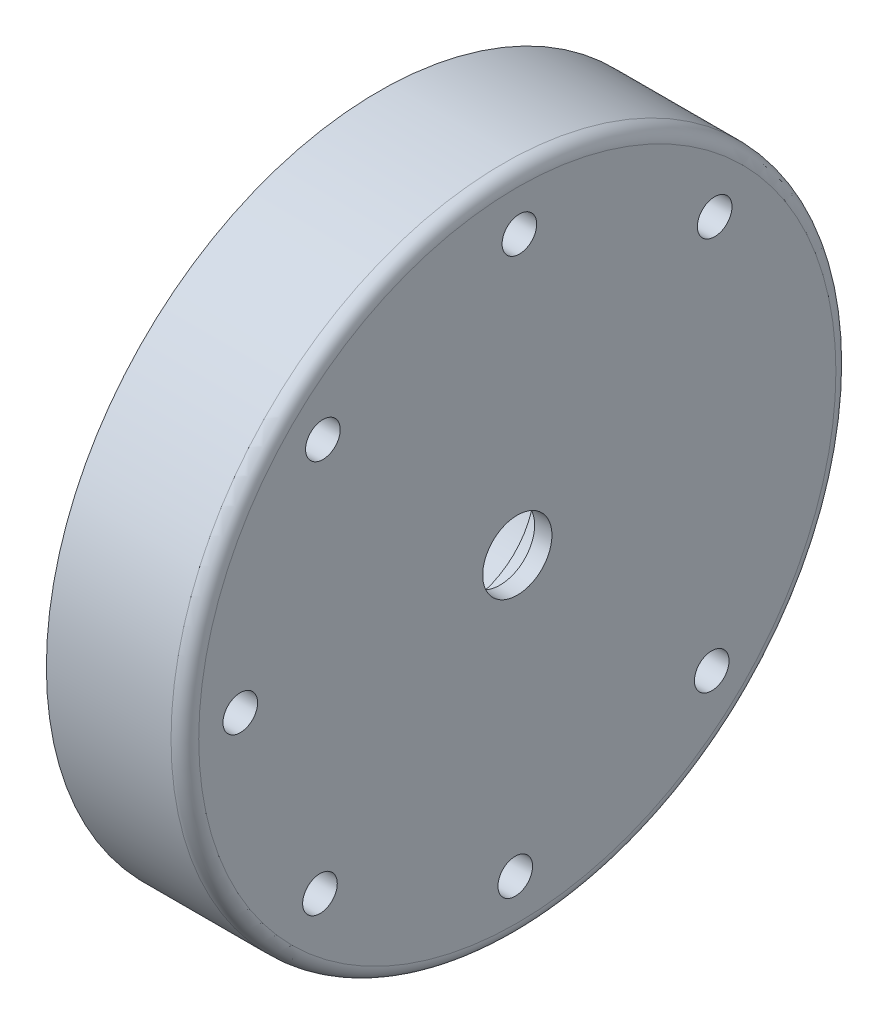
ISO-10303-21;
HEADER;
FILE_DESCRIPTION(('STEP AP214'),'2;1');
FILE_NAME('part.step','',(''),(''),'','','');
FILE_SCHEMA(('AUTOMOTIVE_DESIGN { 1 0 10303 214 1 1 1 1 }'));
ENDSEC;
DATA;
#1=APPLICATION_CONTEXT('core data for automotive mechanical design processes');
#2=APPLICATION_PROTOCOL_DEFINITION('international standard','automotive_design',2000,#1);
#3=PRODUCT_CONTEXT('',#1,'mechanical');
#4=PRODUCT('Part','Part','',(#3));
#5=PRODUCT_RELATED_PRODUCT_CATEGORY('part','',(#4));
#6=PRODUCT_DEFINITION_FORMATION('','',#4);
#7=PRODUCT_DEFINITION_CONTEXT('part definition',#1,'design');
#8=PRODUCT_DEFINITION('design','',#6,#7);
#9=PRODUCT_DEFINITION_SHAPE('','',#8);
#10=(LENGTH_UNIT() NAMED_UNIT(*) SI_UNIT(.MILLI.,.METRE.));
#11=(NAMED_UNIT(*) PLANE_ANGLE_UNIT() SI_UNIT($,.RADIAN.));
#12=(NAMED_UNIT(*) SI_UNIT($,.STERADIAN.) SOLID_ANGLE_UNIT());
#13=UNCERTAINTY_MEASURE_WITH_UNIT(LENGTH_MEASURE(1.E-05),#10,'distance_accuracy_value','');
#14=(GEOMETRIC_REPRESENTATION_CONTEXT(3) GLOBAL_UNCERTAINTY_ASSIGNED_CONTEXT((#13)) GLOBAL_UNIT_ASSIGNED_CONTEXT((#10,
#11,#12)) REPRESENTATION_CONTEXT('',''));
#15=CARTESIAN_POINT('',(0.,0.,0.));
#16=DIRECTION('',(0.,0.,1.));
#17=DIRECTION('',(1.,0.,0.));
#18=AXIS2_PLACEMENT_3D('',#15,#16,#17);
#19=CARTESIAN_POINT('',(0.,0.,0.));
#20=DIRECTION('',(1.,0.,0.));
#21=DIRECTION('',(0.,0.,-1.));
#22=AXIS2_PLACEMENT_3D('',#19,#20,#21);
#23=PLANE('',#22);
#24=CARTESIAN_POINT('',(0.,0.,0.));
#25=DIRECTION('',(1.,0.,0.));
#26=DIRECTION('',(0.,0.,-1.));
#27=AXIS2_PLACEMENT_3D('',#24,#25,#26);
#28=CIRCLE('',#27,60.96);
#29=CARTESIAN_POINT('',(0.,0.,-60.96));
#30=VERTEX_POINT('',#29);
#31=EDGE_CURVE('E49',#30,#30,#28,.T.);
#32=ORIENTED_EDGE('',*,*,#31,.F.);
#33=EDGE_LOOP('',(#32));
#34=FACE_BOUND('',#33,.T.);
#35=CARTESIAN_POINT('',(0.,35.6512740880767,-36.188764221742));
#36=DIRECTION('',(-1.,0.,0.));
#37=DIRECTION('',(0.,0.,1.));
#38=AXIS2_PLACEMENT_3D('',#35,#36,#37);
#39=CIRCLE('',#38,3.175);
#40=CARTESIAN_POINT('',(0.,35.6512740880767,-33.013764221742));
#41=VERTEX_POINT('',#40);
#42=EDGE_CURVE('E74',#41,#41,#39,.T.);
#43=ORIENTED_EDGE('',*,*,#42,.F.);
#44=EDGE_LOOP('',(#43));
#45=FACE_BOUND('',#44,.T.);
#46=CARTESIAN_POINT('',(0.,-36.1887642217416,-35.651274088077));
#47=DIRECTION('',(-1.,0.,0.));
#48=DIRECTION('',(0.,1.,0.));
#49=AXIS2_PLACEMENT_3D('',#46,#47,#48);
#50=CIRCLE('',#49,3.175);
#51=CARTESIAN_POINT('',(0.,-33.0137642217416,-35.651274088077));
#52=VERTEX_POINT('',#51);
#53=EDGE_CURVE('E54',#52,#52,#50,.T.);
#54=ORIENTED_EDGE('',*,*,#53,.F.);
#55=EDGE_LOOP('',(#54));
#56=FACE_BOUND('',#55,.T.);
#57=CARTESIAN_POINT('',(0.,-50.7985782495741,0.380062918335179));
#58=DIRECTION('',(-1.,0.,0.));
#59=DIRECTION('',(0.,0.707106781186554,-0.707106781186541));
#60=AXIS2_PLACEMENT_3D('',#57,#58,#59);
#61=CIRCLE('',#60,3.175);
#62=CARTESIAN_POINT('',(0.,-48.5535142193068,-1.86500111193209));
#63=VERTEX_POINT('',#62);
#64=EDGE_CURVE('E99',#63,#63,#61,.T.);
#65=ORIENTED_EDGE('',*,*,#64,.F.);
#66=EDGE_LOOP('',(#65));
#67=FACE_BOUND('',#66,.T.);
#68=CARTESIAN_POINT('',(0.,-35.6512740880767,36.188764221742));
#69=DIRECTION('',(-1.,0.,0.));
#70=DIRECTION('',(0.,0.,-1.));
#71=AXIS2_PLACEMENT_3D('',#68,#69,#70);
#72=CIRCLE('',#71,3.175);
#73=CARTESIAN_POINT('',(0.,-35.6512740880767,33.013764221742));
#74=VERTEX_POINT('',#73);
#75=EDGE_CURVE('E93',#74,#74,#72,.T.);
#76=ORIENTED_EDGE('',*,*,#75,.F.);
#77=EDGE_LOOP('',(#76));
#78=FACE_BOUND('',#77,.T.);
#79=CARTESIAN_POINT('',(0.,0.380062918335356,50.7985782495741));
#80=DIRECTION('',(-1.,0.,0.));
#81=DIRECTION('',(0.,-0.707106781186544,-0.707106781186551));
#82=AXIS2_PLACEMENT_3D('',#79,#80,#81);
#83=CIRCLE('',#82,3.175);
#84=CARTESIAN_POINT('',(0.,-1.86500111193192,48.5535142193068));
#85=VERTEX_POINT('',#84);
#86=EDGE_CURVE('E87',#85,#85,#83,.T.);
#87=ORIENTED_EDGE('',*,*,#86,.F.);
#88=EDGE_LOOP('',(#87));
#89=FACE_BOUND('',#88,.T.);
#90=CARTESIAN_POINT('',(0.,36.1887642217419,35.6512740880768));
#91=DIRECTION('',(-1.,0.,0.));
#92=DIRECTION('',(0.,-1.,0.));
#93=AXIS2_PLACEMENT_3D('',#90,#91,#92);
#94=CIRCLE('',#93,3.175);
#95=CARTESIAN_POINT('',(0.,33.0137642217419,35.6512740880768));
#96=VERTEX_POINT('',#95);
#97=EDGE_CURVE('E81',#96,#96,#94,.T.);
#98=ORIENTED_EDGE('',*,*,#97,.F.);
#99=EDGE_LOOP('',(#98));
#100=FACE_BOUND('',#99,.T.);
#101=CARTESIAN_POINT('',(0.,50.7985782495741,-0.380062918335537));
#102=DIRECTION('',(-1.,0.,0.));
#103=DIRECTION('',(0.,-0.707106781186549,0.707106781186546));
#104=AXIS2_PLACEMENT_3D('',#101,#102,#103);
#105=CIRCLE('',#104,3.175);
#106=CARTESIAN_POINT('',(0.,48.5535142193068,1.86500111193175));
#107=VERTEX_POINT('',#106);
#108=EDGE_CURVE('E75',#107,#107,#105,.T.);
#109=ORIENTED_EDGE('',*,*,#108,.F.);
#110=EDGE_LOOP('',(#109));
#111=FACE_BOUND('',#110,.T.);
#112=CARTESIAN_POINT('',(0.,0.,0.));
#113=DIRECTION('',(1.,0.,0.));
#114=DIRECTION('',(0.,0.,-1.));
#115=AXIS2_PLACEMENT_3D('',#112,#113,#114);
#116=CIRCLE('',#115,17.499965);
#117=CARTESIAN_POINT('',(0.,0.,-17.499965));
#118=VERTEX_POINT('',#117);
#119=EDGE_CURVE('E11',#118,#118,#116,.F.);
#120=ORIENTED_EDGE('',*,*,#119,.F.);
#121=EDGE_LOOP('',(#120));
#122=FACE_BOUND('',#121,.T.);
#123=ADVANCED_FACE('F33',(#34,#45,#56,#67,#78,#89,#100,#111,#122),#23,.F.);
#124=CARTESIAN_POINT('',(22.225,0.,0.));
#125=DIRECTION('',(1.,0.,0.));
#126=DIRECTION('',(0.,0.,-1.));
#127=AXIS2_PLACEMENT_3D('',#124,#125,#126);
#128=PLANE('',#127);
#129=CARTESIAN_POINT('',(22.225,0.,0.));
#130=DIRECTION('',(1.,0.,0.));
#131=DIRECTION('',(0.,0.,-1.));
#132=AXIS2_PLACEMENT_3D('',#129,#130,#131);
#133=CIRCLE('',#132,6.35);
#134=CARTESIAN_POINT('',(22.225,0.,-6.35));
#135=VERTEX_POINT('',#134);
#136=EDGE_CURVE('E52',#135,#135,#133,.F.);
#137=ORIENTED_EDGE('',*,*,#136,.F.);
#138=EDGE_LOOP('',(#137));
#139=FACE_BOUND('',#138,.T.);
#140=CARTESIAN_POINT('',(22.225,0.,0.));
#141=DIRECTION('',(-1.,0.,0.));
#142=DIRECTION('',(0.,0.,1.));
#143=AXIS2_PLACEMENT_3D('',#140,#141,#142);
#144=CIRCLE('',#143,12.7);
#145=CARTESIAN_POINT('',(22.225,0.,12.7));
#146=VERTEX_POINT('',#145);
#147=EDGE_CURVE('E67',#146,#146,#144,.T.);
#148=ORIENTED_EDGE('',*,*,#147,.T.);
#149=EDGE_LOOP('',(#148));
#150=FACE_BOUND('',#149,.T.);
#151=ADVANCED_FACE('F118',(#139,#150),#128,.F.);
#152=CARTESIAN_POINT('',(25.4,0.,0.));
#153=DIRECTION('',(-1.,0.,0.));
#154=DIRECTION('',(0.,0.,1.));
#155=AXIS2_PLACEMENT_3D('',#152,#153,#154);
#156=CYLINDRICAL_SURFACE('',#155,60.96);
#157=CARTESIAN_POINT('',(22.86,0.,0.));
#158=DIRECTION('',(1.,0.,0.));
#159=DIRECTION('',(0.,0.,-1.));
#160=AXIS2_PLACEMENT_3D('',#157,#158,#159);
#161=CIRCLE('',#160,60.96);
#162=CARTESIAN_POINT('',(22.86,0.,-60.96));
#163=VERTEX_POINT('',#162);
#164=EDGE_CURVE('E40',#163,#163,#161,.F.);
#165=ORIENTED_EDGE('',*,*,#164,.T.);
#166=EDGE_LOOP('',(#165));
#167=FACE_BOUND('',#166,.T.);
#168=ORIENTED_EDGE('',*,*,#31,.T.);
#169=EDGE_LOOP('',(#168));
#170=FACE_BOUND('',#169,.T.);
#171=ADVANCED_FACE('F114',(#167,#170),#156,.T.);
#172=CARTESIAN_POINT('',(25.4,0.,0.));
#173=DIRECTION('',(1.,0.,0.));
#174=DIRECTION('',(0.,0.,-1.));
#175=AXIS2_PLACEMENT_3D('',#172,#173,#174);
#176=PLANE('',#175);
#177=CARTESIAN_POINT('',(25.4,50.7985782495741,-0.380062918335537));
#178=DIRECTION('',(-1.,0.,0.));
#179=DIRECTION('',(0.,-0.707106781186549,0.707106781186546));
#180=AXIS2_PLACEMENT_3D('',#177,#178,#179);
#181=CIRCLE('',#180,3.175);
#182=CARTESIAN_POINT('',(25.4,48.5535142193068,1.86500111193175));
#183=VERTEX_POINT('',#182);
#184=EDGE_CURVE('E71',#183,#183,#181,.T.);
#185=ORIENTED_EDGE('',*,*,#184,.T.);
#186=EDGE_LOOP('',(#185));
#187=FACE_BOUND('',#186,.T.);
#188=CARTESIAN_POINT('',(25.4,36.1887642217419,35.6512740880768));
#189=DIRECTION('',(-1.,0.,0.));
#190=DIRECTION('',(0.,-1.,0.));
#191=AXIS2_PLACEMENT_3D('',#188,#189,#190);
#192=CIRCLE('',#191,3.175);
#193=CARTESIAN_POINT('',(25.4,33.0137642217419,35.6512740880768));
#194=VERTEX_POINT('',#193);
#195=EDGE_CURVE('E78',#194,#194,#192,.T.);
#196=ORIENTED_EDGE('',*,*,#195,.T.);
#197=EDGE_LOOP('',(#196));
#198=FACE_BOUND('',#197,.T.);
#199=CARTESIAN_POINT('',(25.4,0.380062918335356,50.7985782495741));
#200=DIRECTION('',(-1.,0.,0.));
#201=DIRECTION('',(0.,-0.707106781186544,-0.707106781186551));
#202=AXIS2_PLACEMENT_3D('',#199,#200,#201);
#203=CIRCLE('',#202,3.175);
#204=CARTESIAN_POINT('',(25.4,-1.86500111193192,48.5535142193068));
#205=VERTEX_POINT('',#204);
#206=EDGE_CURVE('E84',#205,#205,#203,.T.);
#207=ORIENTED_EDGE('',*,*,#206,.T.);
#208=EDGE_LOOP('',(#207));
#209=FACE_BOUND('',#208,.T.);
#210=CARTESIAN_POINT('',(25.4,-35.6512740880767,36.188764221742));
#211=DIRECTION('',(-1.,0.,0.));
#212=DIRECTION('',(0.,0.,-1.));
#213=AXIS2_PLACEMENT_3D('',#210,#211,#212);
#214=CIRCLE('',#213,3.175);
#215=CARTESIAN_POINT('',(25.4,-35.6512740880767,33.013764221742));
#216=VERTEX_POINT('',#215);
#217=EDGE_CURVE('E90',#216,#216,#214,.T.);
#218=ORIENTED_EDGE('',*,*,#217,.T.);
#219=EDGE_LOOP('',(#218));
#220=FACE_BOUND('',#219,.T.);
#221=CARTESIAN_POINT('',(25.4,-50.7985782495741,0.380062918335179));
#222=DIRECTION('',(-1.,0.,0.));
#223=DIRECTION('',(0.,0.707106781186554,-0.707106781186541));
#224=AXIS2_PLACEMENT_3D('',#221,#222,#223);
#225=CIRCLE('',#224,3.175);
#226=CARTESIAN_POINT('',(25.4,-48.5535142193068,-1.86500111193209));
#227=VERTEX_POINT('',#226);
#228=EDGE_CURVE('E96',#227,#227,#225,.T.);
#229=ORIENTED_EDGE('',*,*,#228,.T.);
#230=EDGE_LOOP('',(#229));
#231=FACE_BOUND('',#230,.T.);
#232=CARTESIAN_POINT('',(25.4,-36.1887642217416,-35.651274088077));
#233=DIRECTION('',(-1.,0.,0.));
#234=DIRECTION('',(0.,1.,0.));
#235=AXIS2_PLACEMENT_3D('',#232,#233,#234);
#236=CIRCLE('',#235,3.175);
#237=CARTESIAN_POINT('',(25.4,-33.0137642217416,-35.651274088077));
#238=VERTEX_POINT('',#237);
#239=EDGE_CURVE('E59',#238,#238,#236,.T.);
#240=ORIENTED_EDGE('',*,*,#239,.T.);
#241=EDGE_LOOP('',(#240));
#242=FACE_BOUND('',#241,.T.);
#243=CARTESIAN_POINT('',(25.4,35.6512740880767,-36.188764221742));
#244=DIRECTION('',(-1.,0.,0.));
#245=DIRECTION('',(0.,0.,1.));
#246=AXIS2_PLACEMENT_3D('',#243,#244,#245);
#247=CIRCLE('',#246,3.175);
#248=CARTESIAN_POINT('',(25.4,35.6512740880767,-33.013764221742));
#249=VERTEX_POINT('',#248);
#250=EDGE_CURVE('E104',#249,#249,#247,.T.);
#251=ORIENTED_EDGE('',*,*,#250,.T.);
#252=EDGE_LOOP('',(#251));
#253=FACE_BOUND('',#252,.T.);
#254=CARTESIAN_POINT('',(25.4,0.,0.));
#255=DIRECTION('',(1.,0.,0.));
#256=DIRECTION('',(0.,0.,-1.));
#257=AXIS2_PLACEMENT_3D('',#254,#255,#256);
#258=CIRCLE('',#257,6.35);
#259=CARTESIAN_POINT('',(25.4,0.,-6.35));
#260=VERTEX_POINT('',#259);
#261=EDGE_CURVE('E107',#260,#260,#258,.T.);
#262=ORIENTED_EDGE('',*,*,#261,.F.);
#263=EDGE_LOOP('',(#262));
#264=FACE_BOUND('',#263,.T.);
#265=CARTESIAN_POINT('',(25.4,0.,0.));
#266=DIRECTION('',(1.,0.,0.));
#267=DIRECTION('',(0.,0.,-1.));
#268=AXIS2_PLACEMENT_3D('',#265,#266,#267);
#269=CIRCLE('',#268,58.42);
#270=CARTESIAN_POINT('',(25.4,0.,-58.42));
#271=VERTEX_POINT('',#270);
#272=EDGE_CURVE('E44',#271,#271,#269,.T.);
#273=ORIENTED_EDGE('',*,*,#272,.T.);
#274=EDGE_LOOP('',(#273));
#275=FACE_BOUND('',#274,.T.);
#276=ADVANCED_FACE('F176',(#187,#198,#209,#220,#231,#242,#253,#264,#275),#176,.T.);
#277=CARTESIAN_POINT('',(22.86,0.,0.));
#278=DIRECTION('',(1.,0.,0.));
#279=DIRECTION('',(0.,0.,-1.));
#280=AXIS2_PLACEMENT_3D('',#277,#278,#279);
#281=TOROIDAL_SURFACE('',#280,58.42,2.54);
#282=ORIENTED_EDGE('',*,*,#164,.F.);
#283=EDGE_LOOP('',(#282));
#284=FACE_BOUND('',#283,.T.);
#285=ORIENTED_EDGE('',*,*,#272,.F.);
#286=EDGE_LOOP('',(#285));
#287=FACE_BOUND('',#286,.T.);
#288=ADVANCED_FACE('F35',(#284,#287),#281,.T.);
#289=CARTESIAN_POINT('',(0.,0.,0.));
#290=DIRECTION('',(1.,0.,0.));
#291=DIRECTION('',(0.,0.,-1.));
#292=AXIS2_PLACEMENT_3D('',#289,#290,#291);
#293=CYLINDRICAL_SURFACE('',#292,6.35);
#294=ORIENTED_EDGE('',*,*,#136,.T.);
#295=EDGE_LOOP('',(#294));
#296=FACE_BOUND('',#295,.T.);
#297=ORIENTED_EDGE('',*,*,#261,.T.);
#298=EDGE_LOOP('',(#297));
#299=FACE_BOUND('',#298,.T.);
#300=ADVANCED_FACE('F172',(#296,#299),#293,.F.);
#301=CARTESIAN_POINT('',(25.4,35.6512740880767,-36.188764221742));
#302=DIRECTION('',(-1.,0.,0.));
#303=DIRECTION('',(0.,0.,1.));
#304=AXIS2_PLACEMENT_3D('',#301,#302,#303);
#305=CYLINDRICAL_SURFACE('',#304,3.175);
#306=ORIENTED_EDGE('',*,*,#250,.F.);
#307=EDGE_LOOP('',(#306));
#308=FACE_BOUND('',#307,.T.);
#309=ORIENTED_EDGE('',*,*,#42,.T.);
#310=EDGE_LOOP('',(#309));
#311=FACE_BOUND('',#310,.T.);
#312=ADVANCED_FACE('F168',(#308,#311),#305,.F.);
#313=CARTESIAN_POINT('',(25.4,-36.1887642217416,-35.651274088077));
#314=DIRECTION('',(-1.,0.,0.));
#315=DIRECTION('',(0.,0.,1.));
#316=AXIS2_PLACEMENT_3D('',#313,#314,#315);
#317=CYLINDRICAL_SURFACE('',#316,3.175);
#318=ORIENTED_EDGE('',*,*,#239,.F.);
#319=EDGE_LOOP('',(#318));
#320=FACE_BOUND('',#319,.T.);
#321=ORIENTED_EDGE('',*,*,#53,.T.);
#322=EDGE_LOOP('',(#321));
#323=FACE_BOUND('',#322,.T.);
#324=ADVANCED_FACE('F164',(#320,#323),#317,.F.);
#325=CARTESIAN_POINT('',(25.4,-50.7985782495741,0.380062918335179));
#326=DIRECTION('',(-1.,0.,0.));
#327=DIRECTION('',(0.,0.,1.));
#328=AXIS2_PLACEMENT_3D('',#325,#326,#327);
#329=CYLINDRICAL_SURFACE('',#328,3.175);
#330=ORIENTED_EDGE('',*,*,#228,.F.);
#331=EDGE_LOOP('',(#330));
#332=FACE_BOUND('',#331,.T.);
#333=ORIENTED_EDGE('',*,*,#64,.T.);
#334=EDGE_LOOP('',(#333));
#335=FACE_BOUND('',#334,.T.);
#336=ADVANCED_FACE('F160',(#332,#335),#329,.F.);
#337=CARTESIAN_POINT('',(25.4,-35.6512740880767,36.188764221742));
#338=DIRECTION('',(-1.,0.,0.));
#339=DIRECTION('',(0.,0.,1.));
#340=AXIS2_PLACEMENT_3D('',#337,#338,#339);
#341=CYLINDRICAL_SURFACE('',#340,3.175);
#342=ORIENTED_EDGE('',*,*,#217,.F.);
#343=EDGE_LOOP('',(#342));
#344=FACE_BOUND('',#343,.T.);
#345=ORIENTED_EDGE('',*,*,#75,.T.);
#346=EDGE_LOOP('',(#345));
#347=FACE_BOUND('',#346,.T.);
#348=ADVANCED_FACE('F156',(#344,#347),#341,.F.);
#349=CARTESIAN_POINT('',(25.4,0.380062918335356,50.7985782495741));
#350=DIRECTION('',(-1.,0.,0.));
#351=DIRECTION('',(0.,0.,1.));
#352=AXIS2_PLACEMENT_3D('',#349,#350,#351);
#353=CYLINDRICAL_SURFACE('',#352,3.175);
#354=ORIENTED_EDGE('',*,*,#206,.F.);
#355=EDGE_LOOP('',(#354));
#356=FACE_BOUND('',#355,.T.);
#357=ORIENTED_EDGE('',*,*,#86,.T.);
#358=EDGE_LOOP('',(#357));
#359=FACE_BOUND('',#358,.T.);
#360=ADVANCED_FACE('F148',(#356,#359),#353,.F.);
#361=CARTESIAN_POINT('',(25.4,36.1887642217419,35.6512740880768));
#362=DIRECTION('',(-1.,0.,0.));
#363=DIRECTION('',(0.,0.,1.));
#364=AXIS2_PLACEMENT_3D('',#361,#362,#363);
#365=CYLINDRICAL_SURFACE('',#364,3.175);
#366=ORIENTED_EDGE('',*,*,#195,.F.);
#367=EDGE_LOOP('',(#366));
#368=FACE_BOUND('',#367,.T.);
#369=ORIENTED_EDGE('',*,*,#97,.T.);
#370=EDGE_LOOP('',(#369));
#371=FACE_BOUND('',#370,.T.);
#372=ADVANCED_FACE('F138',(#368,#371),#365,.F.);
#373=CARTESIAN_POINT('',(25.4,50.7985782495741,-0.380062918335537));
#374=DIRECTION('',(-1.,0.,0.));
#375=DIRECTION('',(0.,0.,1.));
#376=AXIS2_PLACEMENT_3D('',#373,#374,#375);
#377=CYLINDRICAL_SURFACE('',#376,3.175);
#378=ORIENTED_EDGE('',*,*,#184,.F.);
#379=EDGE_LOOP('',(#378));
#380=FACE_BOUND('',#379,.T.);
#381=ORIENTED_EDGE('',*,*,#108,.T.);
#382=EDGE_LOOP('',(#381));
#383=FACE_BOUND('',#382,.T.);
#384=ADVANCED_FACE('F135',(#380,#383),#377,.F.);
#385=CARTESIAN_POINT('',(66.7091781569181,0.,0.));
#386=DIRECTION('',(-1.,0.,0.));
#387=DIRECTION('',(0.,0.,1.));
#388=AXIS2_PLACEMENT_3D('',#385,#386,#387);
#389=CYLINDRICAL_SURFACE('',#388,14.605);
#390=CARTESIAN_POINT('',(15.875,0.,0.));
#391=DIRECTION('',(-1.,0.,0.));
#392=DIRECTION('',(0.,0.,1.));
#393=AXIS2_PLACEMENT_3D('',#390,#391,#392);
#394=CIRCLE('',#393,14.605);
#395=CARTESIAN_POINT('',(15.875,0.,14.605));
#396=VERTEX_POINT('',#395);
#397=EDGE_CURVE('E55',#396,#396,#394,.T.);
#398=ORIENTED_EDGE('',*,*,#397,.F.);
#399=EDGE_LOOP('',(#398));
#400=FACE_BOUND('',#399,.T.);
#401=CARTESIAN_POINT('',(-8.89,0.,0.));
#402=DIRECTION('',(-1.,0.,0.));
#403=DIRECTION('',(0.,0.,1.));
#404=AXIS2_PLACEMENT_3D('',#401,#402,#403);
#405=CIRCLE('',#404,14.605);
#406=CARTESIAN_POINT('',(-8.89,0.,14.605));
#407=VERTEX_POINT('',#406);
#408=EDGE_CURVE('E192',#407,#407,#405,.T.);
#409=ORIENTED_EDGE('',*,*,#408,.T.);
#410=EDGE_LOOP('',(#409));
#411=FACE_BOUND('',#410,.T.);
#412=ADVANCED_FACE('F137',(#400,#411),#389,.F.);
#413=CARTESIAN_POINT('',(15.875,0.,0.));
#414=DIRECTION('',(-1.,0.,0.));
#415=DIRECTION('',(0.,0.,1.));
#416=AXIS2_PLACEMENT_3D('',#413,#414,#415);
#417=PLANE('',#416);
#418=ORIENTED_EDGE('',*,*,#397,.T.);
#419=EDGE_LOOP('',(#418));
#420=FACE_BOUND('',#419,.T.);
#421=CARTESIAN_POINT('',(15.875,0.,0.));
#422=DIRECTION('',(-1.,0.,0.));
#423=DIRECTION('',(0.,0.,1.));
#424=AXIS2_PLACEMENT_3D('',#421,#422,#423);
#425=CIRCLE('',#424,12.7);
#426=CARTESIAN_POINT('',(15.875,0.,12.7));
#427=VERTEX_POINT('',#426);
#428=EDGE_CURVE('E62',#427,#427,#425,.T.);
#429=ORIENTED_EDGE('',*,*,#428,.F.);
#430=EDGE_LOOP('',(#429));
#431=FACE_BOUND('',#430,.T.);
#432=ADVANCED_FACE('F145',(#420,#431),#417,.T.);
#433=CARTESIAN_POINT('',(15.875,0.,0.));
#434=DIRECTION('',(1.,0.,0.));
#435=DIRECTION('',(0.,0.,-1.));
#436=AXIS2_PLACEMENT_3D('',#433,#434,#435);
#437=CYLINDRICAL_SURFACE('',#436,12.7);
#438=ORIENTED_EDGE('',*,*,#428,.T.);
#439=EDGE_LOOP('',(#438));
#440=FACE_BOUND('',#439,.T.);
#441=ORIENTED_EDGE('',*,*,#147,.F.);
#442=EDGE_LOOP('',(#441));
#443=FACE_BOUND('',#442,.T.);
#444=ADVANCED_FACE('F204',(#440,#443),#437,.F.);
#445=CARTESIAN_POINT('',(-8.89,0.,0.));
#446=DIRECTION('',(-1.,0.,0.));
#447=DIRECTION('',(0.,0.,1.));
#448=AXIS2_PLACEMENT_3D('',#445,#446,#447);
#449=PLANE('',#448);
#450=CARTESIAN_POINT('',(-8.89,0.,0.));
#451=DIRECTION('',(-1.,0.,0.));
#452=DIRECTION('',(0.,0.,1.));
#453=AXIS2_PLACEMENT_3D('',#450,#451,#452);
#454=CIRCLE('',#453,17.499965);
#455=CARTESIAN_POINT('',(-8.89,0.,17.499965));
#456=VERTEX_POINT('',#455);
#457=EDGE_CURVE('E190',#456,#456,#454,.T.);
#458=ORIENTED_EDGE('',*,*,#457,.T.);
#459=EDGE_LOOP('',(#458));
#460=FACE_BOUND('',#459,.T.);
#461=ORIENTED_EDGE('',*,*,#408,.F.);
#462=EDGE_LOOP('',(#461));
#463=FACE_BOUND('',#462,.T.);
#464=ADVANCED_FACE('F201',(#460,#463),#449,.T.);
#465=CARTESIAN_POINT('',(-8.89,0.,0.));
#466=DIRECTION('',(1.,0.,0.));
#467=DIRECTION('',(0.,0.,-1.));
#468=AXIS2_PLACEMENT_3D('',#465,#466,#467);
#469=CYLINDRICAL_SURFACE('',#468,17.499965);
#470=ORIENTED_EDGE('',*,*,#457,.F.);
#471=EDGE_LOOP('',(#470));
#472=FACE_BOUND('',#471,.T.);
#473=ORIENTED_EDGE('',*,*,#119,.T.);
#474=EDGE_LOOP('',(#473));
#475=FACE_BOUND('',#474,.T.);
#476=ADVANCED_FACE('F203',(#472,#475),#469,.T.);
#477=CLOSED_SHELL('',(#123,#151,#171,#276,#288,#300,#312,#324,#336,#348,#360,#372,#384,#412,
#432,#444,#464,#476));
#478=MANIFOLD_SOLID_BREP('B2',#477);
#479=ADVANCED_BREP_SHAPE_REPRESENTATION('',(#18,#478),#14);
#480=SHAPE_DEFINITION_REPRESENTATION(#9,#479);
ENDSEC;
END-ISO-10303-21;
